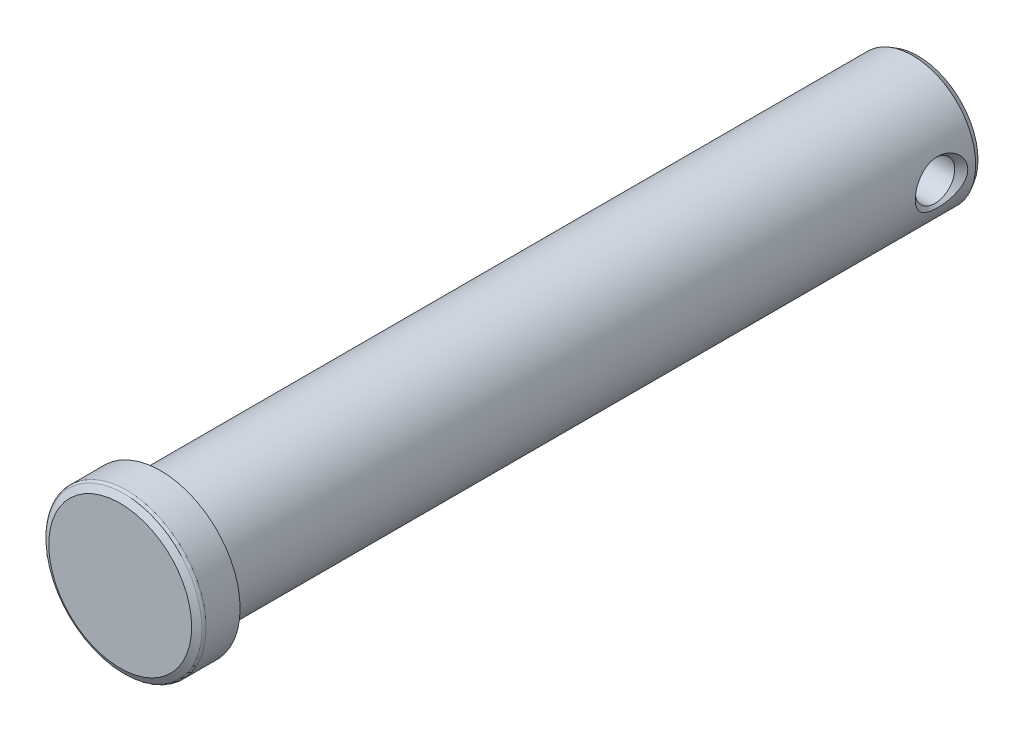
ISO-10303-21;
HEADER;
FILE_DESCRIPTION(('STEP AP214'),'2;1');
FILE_NAME('part.step','',(''),(''),'','','');
FILE_SCHEMA(('AUTOMOTIVE_DESIGN { 1 0 10303 214 1 1 1 1 }'));
ENDSEC;
DATA;
#1=APPLICATION_CONTEXT('core data for automotive mechanical design processes');
#2=APPLICATION_PROTOCOL_DEFINITION('international standard','automotive_design',2000,#1);
#3=PRODUCT_CONTEXT('',#1,'mechanical');
#4=PRODUCT('Part','Part','',(#3));
#5=PRODUCT_RELATED_PRODUCT_CATEGORY('part','',(#4));
#6=PRODUCT_DEFINITION_FORMATION('','',#4);
#7=PRODUCT_DEFINITION_CONTEXT('part definition',#1,'design');
#8=PRODUCT_DEFINITION('design','',#6,#7);
#9=PRODUCT_DEFINITION_SHAPE('','',#8);
#10=(LENGTH_UNIT() NAMED_UNIT(*) SI_UNIT(.MILLI.,.METRE.));
#11=(NAMED_UNIT(*) PLANE_ANGLE_UNIT() SI_UNIT($,.RADIAN.));
#12=(NAMED_UNIT(*) SI_UNIT($,.STERADIAN.) SOLID_ANGLE_UNIT());
#13=UNCERTAINTY_MEASURE_WITH_UNIT(LENGTH_MEASURE(1.E-05),#10,'distance_accuracy_value','');
#14=(GEOMETRIC_REPRESENTATION_CONTEXT(3) GLOBAL_UNCERTAINTY_ASSIGNED_CONTEXT((#13)) GLOBAL_UNIT_ASSIGNED_CONTEXT((#10,
#11,#12)) REPRESENTATION_CONTEXT('',''));
#15=CARTESIAN_POINT('',(0.,0.,0.));
#16=DIRECTION('',(0.,0.,1.));
#17=DIRECTION('',(1.,0.,0.));
#18=AXIS2_PLACEMENT_3D('',#15,#16,#17);
#19=CARTESIAN_POINT('',(0.,0.,38.1));
#20=DIRECTION('',(0.,0.,1.));
#21=DIRECTION('',(1.,0.,0.));
#22=AXIS2_PLACEMENT_3D('',#19,#20,#21);
#23=CYLINDRICAL_SURFACE('',#22,6.35);
#24=CARTESIAN_POINT('',(-6.08946556806022,-1.8002525087912,-35.6705851077295));
#25=CARTESIAN_POINT('',(-6.06500480892005,-1.88300294252601,-35.5376040751017));
#26=CARTESIAN_POINT('',(-6.04208780252657,-1.95438056437325,-35.3970543772474));
#27=CARTESIAN_POINT('',(-6.0022071070109,-2.0736413122893,-35.1052282418399));
#28=CARTESIAN_POINT('',(-5.98525978427759,-2.12145999025203,-34.953923661142));
#29=CARTESIAN_POINT('',(-5.9594412012259,-2.19294825097273,-34.6444373783609));
#30=CARTESIAN_POINT('',(-5.95059939854113,-2.21652978676401,-34.4862327637109));
#31=CARTESIAN_POINT('',(-5.94224537322893,-2.23883139366819,-34.1679736608714));
#32=CARTESIAN_POINT('',(-5.94272563163844,-2.23757150130075,-34.0079207676002));
#33=CARTESIAN_POINT('',(-5.95301173558375,-2.21006073247549,-33.6878458447917));
#34=CARTESIAN_POINT('',(-5.96295774711407,-2.18343422890581,-33.5278604929284));
#35=CARTESIAN_POINT('',(-5.99108067784824,-2.10503465023391,-33.2147948478071));
#36=CARTESIAN_POINT('',(-6.00926382107226,-2.05324255772764,-33.0617198724207));
#37=CARTESIAN_POINT('',(-6.05152450366875,-1.92512205377195,-32.7670084903579));
#38=CARTESIAN_POINT('',(-6.07560360888412,-1.8487871225745,-32.6253751356451));
#39=CARTESIAN_POINT('',(-6.12653277477935,-1.67227347683413,-32.3584112427695));
#40=CARTESIAN_POINT('',(-6.1533796110556,-1.57212233424682,-32.2330621099863));
#41=CARTESIAN_POINT('',(-6.19998908606651,-1.37490911935274,-32.0307777616048));
#42=CARTESIAN_POINT('',(-6.21995373421023,-1.28249277250774,-31.949351027876));
#43=CARTESIAN_POINT('',(-6.25739264510909,-1.08517007903807,-31.8025438227951));
#44=CARTESIAN_POINT('',(-6.27486839322964,-0.980271251107545,-31.7371537638532));
#45=CARTESIAN_POINT('',(-6.30548318326387,-0.758910929136475,-31.6254038692048));
#46=CARTESIAN_POINT('',(-6.31858355851897,-0.642357589379461,-31.5792128707546));
#47=CARTESIAN_POINT('',(-6.33840122682048,-0.402025659880048,-31.5101311092041));
#48=CARTESIAN_POINT('',(-6.3451261630284,-0.278255911024465,-31.4872124438393));
#49=CARTESIAN_POINT('',(-6.35072723579668,-0.0467433764206158,-31.4681168317929));
#50=CARTESIAN_POINT('',(-6.35060520852393,0.0607035962417174,-31.4685266489524));
#51=CARTESIAN_POINT('',(-6.34498911884112,0.273788077103967,-31.4876872425124));
#52=CARTESIAN_POINT('',(-6.33949588556502,0.379425862020839,-31.5064351881214));
#53=CARTESIAN_POINT('',(-6.32417756565913,0.580469698916779,-31.5596405265989));
#54=CARTESIAN_POINT('',(-6.31458758844323,0.676122816790439,-31.5932483452856));
#55=CARTESIAN_POINT('',(-6.29204970566504,0.860983601418236,-31.6741651708111));
#56=CARTESIAN_POINT('',(-6.2791009947285,0.950189715708347,-31.7214774640965));
#57=CARTESIAN_POINT('',(-6.24946250639317,1.12951599782499,-31.8333344004952));
#58=CARTESIAN_POINT('',(-6.23252592691544,1.21880237139196,-31.8991440353826));
#59=CARTESIAN_POINT('',(-6.19728918701554,1.38690218777346,-32.0426604547941));
#60=CARTESIAN_POINT('',(-6.17898824777129,1.4657095762787,-32.120374061611));
#61=CARTESIAN_POINT('',(-6.13913686365532,1.62524078846704,-32.3001620747707));
#62=CARTESIAN_POINT('',(-6.11758305487082,1.7038473644036,-32.4041151526272));
#63=CARTESIAN_POINT('',(-6.0764153999034,1.84529361558585,-32.622594523765));
#64=CARTESIAN_POINT('',(-6.05680280863153,1.90812313147493,-32.7371275652363));
#65=CARTESIAN_POINT('',(-6.01845917586724,2.0261028027157,-32.9925726985285));
#66=CARTESIAN_POINT('',(-6.00033329120438,2.078563618698,-33.1348253816691));
#67=CARTESIAN_POINT('',(-5.97099633519703,2.1613971099314,-33.4263028000725));
#68=CARTESIAN_POINT('',(-5.95978695701826,2.19176437699161,-33.5755292329041));
#69=CARTESIAN_POINT('',(-5.94516202384055,2.23115255724621,-33.8863956561425));
#70=CARTESIAN_POINT('',(-5.94225933620213,2.23877001127639,-34.0482402682001));
#71=CARTESIAN_POINT('',(-5.94610101898477,2.22854328247117,-34.3710031219965));
#72=CARTESIAN_POINT('',(-5.95284586651847,2.21069784038477,-34.5319213175247));
#73=CARTESIAN_POINT('',(-5.97511909577176,2.14976679229751,-34.8487475863668));
#74=CARTESIAN_POINT('',(-5.99067195482379,2.10661083680852,-35.004640412775));
#75=CARTESIAN_POINT('',(-6.02857982288002,1.99553332203208,-35.3066174397112));
#76=CARTESIAN_POINT('',(-6.05093966695412,1.92759415215532,-35.4526945777297));
#77=CARTESIAN_POINT('',(-6.09945399599868,1.76807007244952,-35.7295721195209));
#78=CARTESIAN_POINT('',(-6.12558665370247,1.67661896153771,-35.8604530739152));
#79=CARTESIAN_POINT('',(-6.1782403973682,1.47073550363506,-36.1025554266451));
#80=CARTESIAN_POINT('',(-6.20476068510954,1.35634551284692,-36.2138123589557));
#81=CARTESIAN_POINT('',(-6.24722726538169,1.14150892720777,-36.3827459673761));
#82=CARTESIAN_POINT('',(-6.26405280688227,1.04615300442206,-36.4466979073511));
#83=CARTESIAN_POINT('',(-6.29422437498016,0.845849711646498,-36.5584042775127));
#84=CARTESIAN_POINT('',(-6.30757331110262,0.740910461813067,-36.6061722619782));
#85=CARTESIAN_POINT('',(-6.32937545727361,0.52302231496942,-36.6830503040396));
#86=CARTESIAN_POINT('',(-6.33779464021358,0.410023650646075,-36.7120308267339));
#87=CARTESIAN_POINT('',(-6.34847673905213,0.180330946879257,-36.7486665383719));
#88=CARTESIAN_POINT('',(-6.35074333034458,0.063639155782347,-36.7563344589601));
#89=CARTESIAN_POINT('',(-6.34892866518301,-0.155812740536091,-36.7501493854636));
#90=CARTESIAN_POINT('',(-6.34553766901893,-0.258653034809978,-36.7386367708582));
#91=CARTESIAN_POINT('',(-6.33406633574385,-0.460820581321476,-36.6991559544886));
#92=CARTESIAN_POINT('',(-6.32598614225238,-0.560147941053502,-36.6711882567061));
#93=CARTESIAN_POINT('',(-6.30594374300713,-0.75299616537357,-36.600313121469));
#94=CARTESIAN_POINT('',(-6.29397610210368,-0.846508680692122,-36.5573847609307));
#95=CARTESIAN_POINT('',(-6.2672271323794,-1.02596917611207,-36.4585401872414));
#96=CARTESIAN_POINT('',(-6.25244376570881,-1.11191161116184,-36.4026145609714));
#97=CARTESIAN_POINT('',(-6.21909656985284,-1.28617283380978,-36.2714795187687));
#98=CARTESIAN_POINT('',(-6.20029178438864,-1.37324818408096,-36.194686449477));
#99=CARTESIAN_POINT('',(-6.16214963339903,-1.53536698073819,-36.0296294095048));
#100=CARTESIAN_POINT('',(-6.14281281527593,-1.61042228910788,-35.9413769053114));
#101=CARTESIAN_POINT('',(-6.11221857254795,-1.72198668265558,-35.7909271009807));
#102=CARTESIAN_POINT('',(-6.10067983343983,-1.76231479316832,-35.7315515144463));
#103=CARTESIAN_POINT('',(-6.08946556806022,-1.8002525087912,-35.6705851077295));
#104=B_SPLINE_CURVE_WITH_KNOTS('',3,(#24,#25,#26,#27,#28,#29,#30,#31,#32,#33,#34,#35,#36,#37,
#38,#39,#40,#41,#42,#43,#44,#45,#46,#47,#48,#49,#50,#51,#52,#53,#54,#55,#56,#57,#58,#59,#60,#61,
#62,#63,#64,#65,#66,#67,#68,#69,#70,#71,#72,#73,#74,#75,#76,#77,#78,#79,#80,#81,#82,#83,#84,#85,
#86,#87,#88,#89,#90,#91,#92,#93,#94,#95,#96,#97,#98,#99,#100,#101,#102,#103),.UNSPECIFIED.,.T.,
.F.,(4,2,2,2,2,2,2,2,2,2,2,2,2,2,2,2,2,2,2,2,2,2,2,2,2,2,2,2,2,2,2,2,2,2,2,2,2,2,2,4),(0.,
0.475345116727028,0.951983470667516,1.43034726725992,1.90832524250667,2.3934929202136,
2.87902780623024,3.36469178017719,3.8497962163968,4.2226716286508,4.59532356942102,
4.97118662303262,5.34659850325448,5.66724743669547,5.98784688051472,6.292102503239,
6.59643114947533,6.93178242409056,7.26732661618259,7.66210046034174,8.05712786393975,
8.513232506931,8.96944876041124,9.45328164912772,9.93713846631535,10.4223465593295,
10.9079001078781,11.3907494347638,11.8727152658357,12.2194746987905,12.5659429940092,
12.9147753878844,13.2633993527014,13.572515550398,13.8816222810624,14.1911630562253,
14.5009287152005,14.8524821484737,15.2036864843368,15.4216129295191),.UNSPECIFIED.);
#105=CARTESIAN_POINT('',(-6.08946556806022,-1.8002525087912,-35.6705851077295));
#106=VERTEX_POINT('',#105);
#107=EDGE_CURVE('E54',#106,#106,#104,.T.);
#108=ORIENTED_EDGE('',*,*,#107,.F.);
#109=EDGE_LOOP('',(#108));
#110=FACE_BOUND('',#109,.T.);
#111=CARTESIAN_POINT('',(0.,0.,37.7825));
#112=DIRECTION('',(0.,0.,1.));
#113=DIRECTION('',(1.,0.,0.));
#114=AXIS2_PLACEMENT_3D('',#111,#112,#113);
#115=CIRCLE('',#114,6.35);
#116=CARTESIAN_POINT('',(6.35,0.,37.7825));
#117=VERTEX_POINT('',#116);
#118=EDGE_CURVE('E10',#117,#117,#115,.F.);
#119=ORIENTED_EDGE('',*,*,#118,.T.);
#120=EDGE_LOOP('',(#119));
#121=FACE_BOUND('',#120,.T.);
#122=CARTESIAN_POINT('',(0.,0.,-37.5500738685969));
#123=DIRECTION('',(0.,0.,1.));
#124=DIRECTION('',(1.,0.,0.));
#125=AXIS2_PLACEMENT_3D('',#122,#123,#124);
#126=CIRCLE('',#125,6.35);
#127=CARTESIAN_POINT('',(6.35,0.,-37.5500738685969));
#128=VERTEX_POINT('',#127);
#129=EDGE_CURVE('E120',#128,#128,#126,.T.);
#130=ORIENTED_EDGE('',*,*,#129,.T.);
#131=EDGE_LOOP('',(#130));
#132=FACE_BOUND('',#131,.T.);
#133=CARTESIAN_POINT('',(6.08946556806022,-1.80025250879121,-35.6705851077295));
#134=CARTESIAN_POINT('',(6.11189885307447,-1.72437582976485,-35.7925115513243));
#135=CARTESIAN_POINT('',(6.13567120927757,-1.63879505075025,-35.9083158181569));
#136=CARTESIAN_POINT('',(6.18326701862847,-1.4488838411212,-36.1236028311477));
#137=CARTESIAN_POINT('',(6.20709048724993,-1.34454658363101,-36.2230796092159));
#138=CARTESIAN_POINT('',(6.24721455696843,-1.14158319658968,-36.3826960498219));
#139=CARTESIAN_POINT('',(6.26405885665663,-1.04612617970624,-36.4467209222515));
#140=CARTESIAN_POINT('',(6.29425628313995,-0.845624573699038,-36.5585217925724));
#141=CARTESIAN_POINT('',(6.30761283559113,-0.740589529976808,-36.6063137483764));
#142=CARTESIAN_POINT('',(6.32942136453854,-0.52248879681383,-36.6832100165142));
#143=CARTESIAN_POINT('',(6.33783881091457,-0.409372628572175,-36.712182908602));
#144=CARTESIAN_POINT('',(6.34850391117207,-0.179446866223698,-36.7487590926882));
#145=CARTESIAN_POINT('',(6.35075521626093,-0.0626394992872966,-36.756375031017));
#146=CARTESIAN_POINT('',(6.34890153743061,0.156905979489945,-36.7500569355074));
#147=CARTESIAN_POINT('',(6.34549344786971,0.259726648315926,-36.7384858281983));
#148=CARTESIAN_POINT('',(6.33399080315791,0.461854344791243,-36.6988947392515));
#149=CARTESIAN_POINT('',(6.32589601519649,0.56116119763264,-36.6708739404787));
#150=CARTESIAN_POINT('',(6.30582430674266,0.75399727275381,-36.5998863541959));
#151=CARTESIAN_POINT('',(6.29384055195132,0.847515976142199,-36.55689324521));
#152=CARTESIAN_POINT('',(6.26706716802248,1.02694321544018,-36.4579396142315));
#153=CARTESIAN_POINT('',(6.25227656719524,1.11284910074856,-36.401974600062));
#154=CARTESIAN_POINT('',(6.21892575998042,1.28699227823206,-36.2707877531108));
#155=CARTESIAN_POINT('',(6.20012607810153,1.37399201618974,-36.1939888934815));
#156=CARTESIAN_POINT('',(6.16197335204065,1.53607631546078,-36.0288468983292));
#157=CARTESIAN_POINT('',(6.14261996400546,1.61115327445182,-35.9404964621068));
#158=CARTESIAN_POINT('',(6.10140351613906,1.76139158640437,-35.7376620687535));
#159=CARTESIAN_POINT('',(6.07971776048924,1.83412358453758,-35.6213391839536));
#160=CARTESIAN_POINT('',(6.03969744478187,1.96189737041277,-35.3788156141223));
#161=CARTESIAN_POINT('',(6.02136479154187,2.01692910590803,-35.252609366589));
#162=CARTESIAN_POINT('',(5.98773555422385,2.11484477852755,-34.9762790094029));
#163=CARTESIAN_POINT('',(5.97314111857424,2.15522747635952,-34.8251757795304));
#164=CARTESIAN_POINT('',(5.95222989788353,2.21232631826541,-34.5180121640277));
#165=CARTESIAN_POINT('',(5.94591410081834,2.22903963764574,-34.3619511890141));
#166=CARTESIAN_POINT('',(5.94228838161847,2.23869386932952,-34.0436255391491));
#167=CARTESIAN_POINT('',(5.94529359255187,2.23080289010089,-33.8813311122064));
#168=CARTESIAN_POINT('',(5.96060707529366,2.18955108708922,-33.5604479532095));
#169=CARTESIAN_POINT('',(5.97291664199062,2.15618671816425,-33.401859740117));
#170=CARTESIAN_POINT('',(6.00523220188742,2.06447084476844,-33.0928139708271));
#171=CARTESIAN_POINT('',(6.0252418465513,2.00610748400591,-32.9423603107909));
#172=CARTESIAN_POINT('',(6.0704127050017,1.86495709107726,-32.6540102016395));
#173=CARTESIAN_POINT('',(6.09557758354086,1.78215266568471,-32.5161227869291));
#174=CARTESIAN_POINT('',(6.14721222459255,1.59484330121307,-32.2606569157582));
#175=CARTESIAN_POINT('',(6.17364381078571,1.4908271326132,-32.1427147763513));
#176=CARTESIAN_POINT('',(6.22456851695178,1.26132323708167,-31.929560750757));
#177=CARTESIAN_POINT('',(6.24906636381853,1.13589039856351,-31.8342922130148));
#178=CARTESIAN_POINT('',(6.28540113685932,0.908346095763533,-31.6982080394794));
#179=CARTESIAN_POINT('',(6.29880790373836,0.811076327864129,-31.649668778725));
#180=CARTESIAN_POINT('',(6.32148927889785,0.609521816653048,-31.5689062250587));
#181=CARTESIAN_POINT('',(6.33076759780302,0.505243470055969,-31.5366682770526));
#182=CARTESIAN_POINT('',(6.34419395123225,0.291844893096903,-31.4903368699096));
#183=CARTESIAN_POINT('',(6.34831761520562,0.182704169984703,-31.4763295903039));
#184=CARTESIAN_POINT('',(6.35083977755019,-0.0364115933576421,-31.4677391597493));
#185=CARTESIAN_POINT('',(6.34923907328846,-0.146386515259938,-31.4731533035234));
#186=CARTESIAN_POINT('',(6.34085413255749,-0.355208505466416,-31.501857193427));
#187=CARTESIAN_POINT('',(6.33447160838138,-0.45426759333662,-31.523762227413));
#188=CARTESIAN_POINT('',(6.31765206007372,-0.647443204653349,-31.5825475786945));
#189=CARTESIAN_POINT('',(6.30721434093977,-0.741558877728848,-31.6194304630285));
#190=CARTESIAN_POINT('',(6.28261327724273,-0.927651644214925,-31.7086466651868));
#191=CARTESIAN_POINT('',(6.26828610687198,-1.01927058904418,-31.7616762733222));
#192=CARTESIAN_POINT('',(6.23743144988352,-1.19365245639292,-31.880142193726));
#193=CARTESIAN_POINT('',(6.22090297266944,-1.27641136143826,-31.9455840972305));
#194=CARTESIAN_POINT('',(6.18416451606159,-1.4447030026332,-32.0980719283945));
#195=CARTESIAN_POINT('',(6.16378710917425,-1.52858343017283,-32.1868984967215));
#196=CARTESIAN_POINT('',(6.12348829020788,-1.6827812757831,-32.3757167789207));
#197=CARTESIAN_POINT('',(6.10356719773982,-1.7530894290545,-32.4757160465753));
#198=CARTESIAN_POINT('',(6.06245060141608,-1.8908300496121,-32.7028082667539));
#199=CARTESIAN_POINT('',(6.04164029290323,-1.95561508845976,-32.8315827180628));
#200=CARTESIAN_POINT('',(6.00498393293476,-2.0654351180514,-33.0979474364711));
#201=CARTESIAN_POINT('',(5.98913957784354,-2.11046336199131,-33.2355406967757));
#202=CARTESIAN_POINT('',(5.96283306522677,-2.18376170807069,-33.5302238771174));
#203=CARTESIAN_POINT('',(5.95305462062976,-2.20994473845573,-33.6878993965439));
#204=CARTESIAN_POINT('',(5.94275054135037,-2.23750616897616,-34.0057768775783));
#205=CARTESIAN_POINT('',(5.94222987606924,-2.238871247312,-34.1659801498629));
#206=CARTESIAN_POINT('',(5.95057899844324,-2.21658575266837,-34.4868645223076));
#207=CARTESIAN_POINT('',(5.95959388675535,-2.19254864473195,-34.6475148144247));
#208=CARTESIAN_POINT('',(5.98604352484256,-2.1192661549129,-34.9620283430453));
#209=CARTESIAN_POINT('',(6.00346320460979,-2.0700658817951,-35.1159031912729));
#210=CARTESIAN_POINT('',(6.03367699203313,-1.97943564895926,-35.3347009002995));
#211=CARTESIAN_POINT('',(6.04411315731117,-1.94743913444231,-35.4039910723779));
#212=CARTESIAN_POINT('',(6.06606240733106,-1.87795598407714,-35.5396232214436));
#213=CARTESIAN_POINT('',(6.07757591475985,-1.84046719008438,-35.6059640260836));
#214=CARTESIAN_POINT('',(6.08946556806022,-1.80025250879121,-35.6705851077295));
#215=B_SPLINE_CURVE_WITH_KNOTS('',3,(#133,#134,#135,#136,#137,#138,#139,#140,#141,#142,#143,
#144,#145,#146,#147,#148,#149,#150,#151,#152,#153,#154,#155,#156,#157,#158,#159,#160,#161,#162,
#163,#164,#165,#166,#167,#168,#169,#170,#171,#172,#173,#174,#175,#176,#177,#178,#179,#180,#181,
#182,#183,#184,#185,#186,#187,#188,#189,#190,#191,#192,#193,#194,#195,#196,#197,#198,#199,#200,
#201,#202,#203,#204,#205,#206,#207,#208,#209,#210,#211,#212,#213,#214),.UNSPECIFIED.,.T.,.F.,(4,
2,2,2,2,2,2,2,2,2,2,2,2,2,2,2,2,2,2,2,2,2,2,2,2,2,2,2,2,2,2,2,2,2,2,2,2,2,2,2,4),(0.,
0.435784881783131,0.871728700388985,1.21883366992793,1.56559642051268,1.91475542096825,
2.26370762632091,2.57278757624339,2.88188288094847,3.19152434462416,3.50127319791483,
3.85263955839028,4.20422906878143,4.61926176838314,5.03452975684516,5.5036567623974,
5.97283974865122,6.4580561128942,6.94334001720641,7.42885433278455,7.91471499597782,
8.39043932559316,8.86496224450962,9.19223303237606,9.5192090740652,9.84772524059639,
10.1761956487556,10.4797920034177,10.7834404131219,11.1026854432247,11.4220746232922,
11.7922618726109,12.1627009349645,12.5978453728829,13.0331382940766,13.5112994067704,
13.9897171795833,14.4755211094538,14.9604571992523,15.1913324594131,15.422298684585),.UNSPECIFIED.);
#216=CARTESIAN_POINT('',(6.08946556806022,-1.80025250879121,-35.6705851077295));
#217=VERTEX_POINT('',#216);
#218=EDGE_CURVE('E62',#217,#217,#215,.T.);
#219=ORIENTED_EDGE('',*,*,#218,.F.);
#220=EDGE_LOOP('',(#219));
#221=FACE_BOUND('',#220,.T.);
#222=ADVANCED_FACE('F36',(#110,#121,#132,#221),#23,.T.);
#223=CARTESIAN_POINT('',(0.,0.,-38.1));
#224=DIRECTION('',(0.,0.,1.));
#225=DIRECTION('',(1.,0.,0.));
#226=AXIS2_PLACEMENT_3D('',#223,#224,#225);
#227=CONICAL_SURFACE('',#226,6.0325,0.523598775598289);
#228=ORIENTED_EDGE('',*,*,#129,.F.);
#229=EDGE_LOOP('',(#228));
#230=FACE_BOUND('',#229,.T.);
#231=CARTESIAN_POINT('',(0.,0.,-38.1));
#232=DIRECTION('',(0.,0.,1.));
#233=DIRECTION('',(1.,0.,0.));
#234=AXIS2_PLACEMENT_3D('',#231,#232,#233);
#235=CIRCLE('',#234,6.0325);
#236=CARTESIAN_POINT('',(6.0325,0.,-38.1));
#237=VERTEX_POINT('',#236);
#238=EDGE_CURVE('E124',#237,#237,#235,.T.);
#239=ORIENTED_EDGE('',*,*,#238,.T.);
#240=EDGE_LOOP('',(#239));
#241=FACE_BOUND('',#240,.T.);
#242=ADVANCED_FACE('F105',(#230,#241),#227,.T.);
#243=CARTESIAN_POINT('',(0.,8.001,38.1));
#244=DIRECTION('',(0.,0.,1.));
#245=DIRECTION('',(1.,0.,0.));
#246=AXIS2_PLACEMENT_3D('',#243,#244,#245);
#247=PLANE('',#246);
#248=CARTESIAN_POINT('',(0.,0.,38.1));
#249=DIRECTION('',(0.,0.,1.));
#250=DIRECTION('',(1.,0.,0.));
#251=AXIS2_PLACEMENT_3D('',#248,#249,#250);
#252=CIRCLE('',#251,6.6675);
#253=CARTESIAN_POINT('',(6.6675,0.,38.1));
#254=VERTEX_POINT('',#253);
#255=EDGE_CURVE('E44',#254,#254,#252,.T.);
#256=ORIENTED_EDGE('',*,*,#255,.T.);
#257=EDGE_LOOP('',(#256));
#258=FACE_BOUND('',#257,.T.);
#259=CARTESIAN_POINT('',(0.,0.,38.1));
#260=DIRECTION('',(0.,0.,1.));
#261=DIRECTION('',(1.,0.,0.));
#262=AXIS2_PLACEMENT_3D('',#259,#260,#261);
#263=CIRCLE('',#262,8.001);
#264=CARTESIAN_POINT('',(8.001,0.,38.1));
#265=VERTEX_POINT('',#264);
#266=EDGE_CURVE('E130',#265,#265,#263,.T.);
#267=ORIENTED_EDGE('',*,*,#266,.F.);
#268=EDGE_LOOP('',(#267));
#269=FACE_BOUND('',#268,.T.);
#270=ADVANCED_FACE('F102',(#258,#269),#247,.F.);
#271=CARTESIAN_POINT('',(0.,0.,38.1));
#272=DIRECTION('',(0.,0.,1.));
#273=DIRECTION('',(1.,0.,0.));
#274=AXIS2_PLACEMENT_3D('',#271,#272,#273);
#275=CYLINDRICAL_SURFACE('',#274,8.001);
#276=CARTESIAN_POINT('',(0.,0.,41.511420990735));
#277=DIRECTION('',(0.,0.,-1.));
#278=DIRECTION('',(-1.,0.,0.));
#279=AXIS2_PLACEMENT_3D('',#276,#277,#278);
#280=CIRCLE('',#279,8.001);
#281=CARTESIAN_POINT('',(-8.001,0.,41.511420990735));
#282=VERTEX_POINT('',#281);
#283=EDGE_CURVE('E49',#282,#282,#280,.T.);
#284=ORIENTED_EDGE('',*,*,#283,.T.);
#285=EDGE_LOOP('',(#284));
#286=FACE_BOUND('',#285,.T.);
#287=ORIENTED_EDGE('',*,*,#266,.T.);
#288=EDGE_LOOP('',(#287));
#289=FACE_BOUND('',#288,.T.);
#290=ADVANCED_FACE('F99',(#286,#289),#275,.T.);
#291=CARTESIAN_POINT('',(0.,0.,41.6947297012027));
#292=DIRECTION('',(0.,0.,-1.));
#293=DIRECTION('',(-1.,0.,0.));
#294=AXIS2_PLACEMENT_3D('',#291,#292,#293);
#295=CONICAL_SURFACE('',#294,8.001,1.04719755119659);
#296=CARTESIAN_POINT('',(0.,0.,41.7863840564365));
#297=DIRECTION('',(0.,0.,1.));
#298=DIRECTION('',(1.,0.,0.));
#299=AXIS2_PLACEMENT_3D('',#296,#297,#298);
#300=CIRCLE('',#299,7.84225);
#301=CARTESIAN_POINT('',(7.84225,0.,41.7863840564365));
#302=VERTEX_POINT('',#301);
#303=EDGE_CURVE('E136',#302,#302,#300,.T.);
#304=ORIENTED_EDGE('',*,*,#303,.T.);
#305=EDGE_LOOP('',(#304));
#306=FACE_BOUND('',#305,.T.);
#307=CARTESIAN_POINT('',(0.,0.,42.164));
#308=DIRECTION('',(0.,0.,1.));
#309=DIRECTION('',(1.,0.,0.));
#310=AXIS2_PLACEMENT_3D('',#307,#308,#309);
#311=CIRCLE('',#310,7.1882);
#312=CARTESIAN_POINT('',(7.1882,0.,42.164));
#313=VERTEX_POINT('',#312);
#314=EDGE_CURVE('E126',#313,#313,#311,.T.);
#315=ORIENTED_EDGE('',*,*,#314,.F.);
#316=EDGE_LOOP('',(#315));
#317=FACE_BOUND('',#316,.T.);
#318=ADVANCED_FACE('F95',(#306,#317),#295,.T.);
#319=CARTESIAN_POINT('',(0.,0.,42.164));
#320=DIRECTION('',(0.,0.,-1.));
#321=DIRECTION('',(-1.,0.,0.));
#322=AXIS2_PLACEMENT_3D('',#319,#320,#321);
#323=PLANE('',#322);
#324=ORIENTED_EDGE('',*,*,#314,.T.);
#325=EDGE_LOOP('',(#324));
#326=FACE_BOUND('',#325,.T.);
#327=ADVANCED_FACE('F91',(#326),#323,.F.);
#328=CARTESIAN_POINT('',(0.,6.0325,-38.1));
#329=DIRECTION('',(0.,0.,1.));
#330=DIRECTION('',(1.,0.,0.));
#331=AXIS2_PLACEMENT_3D('',#328,#329,#330);
#332=PLANE('',#331);
#333=ORIENTED_EDGE('',*,*,#238,.F.);
#334=EDGE_LOOP('',(#333));
#335=FACE_BOUND('',#334,.T.);
#336=ADVANCED_FACE('F87',(#335),#332,.F.);
#337=CARTESIAN_POINT('',(0.,0.,41.511420990735));
#338=DIRECTION('',(0.,0.,-1.));
#339=DIRECTION('',(-1.,0.,0.));
#340=AXIS2_PLACEMENT_3D('',#337,#338,#339);
#341=TOROIDAL_SURFACE('',#340,7.6835,0.3175);
#342=ORIENTED_EDGE('',*,*,#283,.F.);
#343=EDGE_LOOP('',(#342));
#344=FACE_BOUND('',#343,.T.);
#345=ORIENTED_EDGE('',*,*,#303,.F.);
#346=EDGE_LOOP('',(#345));
#347=FACE_BOUND('',#346,.T.);
#348=ADVANCED_FACE('F90',(#344,#347),#341,.T.);
#349=CARTESIAN_POINT('',(0.,0.,37.7825));
#350=DIRECTION('',(0.,0.,1.));
#351=DIRECTION('',(1.,0.,0.));
#352=AXIS2_PLACEMENT_3D('',#349,#350,#351);
#353=TOROIDAL_SURFACE('',#352,6.6675,0.3175);
#354=ORIENTED_EDGE('',*,*,#118,.F.);
#355=EDGE_LOOP('',(#354));
#356=FACE_BOUND('',#355,.T.);
#357=ORIENTED_EDGE('',*,*,#255,.F.);
#358=EDGE_LOOP('',(#357));
#359=FACE_BOUND('',#358,.T.);
#360=ADVANCED_FACE('F38',(#356,#359),#353,.F.);
#361=CARTESIAN_POINT('',(-6.35,0.,-34.1122));
#362=DIRECTION('',(-1.,0.,0.));
#363=DIRECTION('',(0.,0.,1.));
#364=AXIS2_PLACEMENT_3D('',#361,#362,#363);
#365=CONICAL_SURFACE('',#364,2.6416,0.78539816339745);
#366=CARTESIAN_POINT('',(-5.6896,0.,-34.1122));
#367=DIRECTION('',(-1.,0.,0.));
#368=DIRECTION('',(0.,0.,1.));
#369=AXIS2_PLACEMENT_3D('',#366,#367,#368);
#370=CIRCLE('',#369,1.98119999999999);
#371=CARTESIAN_POINT('',(-5.6896,0.,-32.131));
#372=VERTEX_POINT('',#371);
#373=EDGE_CURVE('E52',#372,#372,#370,.F.);
#374=ORIENTED_EDGE('',*,*,#373,.T.);
#375=EDGE_LOOP('',(#374));
#376=FACE_BOUND('',#375,.T.);
#377=ORIENTED_EDGE('',*,*,#107,.T.);
#378=EDGE_LOOP('',(#377));
#379=FACE_BOUND('',#378,.T.);
#380=ADVANCED_FACE('F77',(#376,#379),#365,.F.);
#381=CARTESIAN_POINT('',(3.70840000000002,0.,-34.1122));
#382=DIRECTION('',(1.,0.,0.));
#383=DIRECTION('',(0.,0.,-1.));
#384=AXIS2_PLACEMENT_3D('',#381,#382,#383);
#385=CONICAL_SURFACE('',#384,0.,0.78539816339745);
#386=CARTESIAN_POINT('',(5.68959999999999,0.,-34.1122));
#387=DIRECTION('',(1.,0.,0.));
#388=DIRECTION('',(0.,0.,-1.));
#389=AXIS2_PLACEMENT_3D('',#386,#387,#388);
#390=CIRCLE('',#389,1.98119999999999);
#391=CARTESIAN_POINT('',(5.68959999999999,0.,-36.0934));
#392=VERTEX_POINT('',#391);
#393=EDGE_CURVE('E40',#392,#392,#390,.F.);
#394=ORIENTED_EDGE('',*,*,#393,.T.);
#395=EDGE_LOOP('',(#394));
#396=FACE_BOUND('',#395,.T.);
#397=ORIENTED_EDGE('',*,*,#218,.T.);
#398=EDGE_LOOP('',(#397));
#399=FACE_BOUND('',#398,.T.);
#400=ADVANCED_FACE('F81',(#396,#399),#385,.F.);
#401=CARTESIAN_POINT('',(-8.001,0.,-34.1122));
#402=DIRECTION('',(1.,0.,0.));
#403=DIRECTION('',(0.,0.,-1.));
#404=AXIS2_PLACEMENT_3D('',#401,#402,#403);
#405=CYLINDRICAL_SURFACE('',#404,1.98119999999999);
#406=ORIENTED_EDGE('',*,*,#373,.F.);
#407=EDGE_LOOP('',(#406));
#408=FACE_BOUND('',#407,.T.);
#409=ORIENTED_EDGE('',*,*,#393,.F.);
#410=EDGE_LOOP('',(#409));
#411=FACE_BOUND('',#410,.T.);
#412=ADVANCED_FACE('F83',(#408,#411),#405,.F.);
#413=CLOSED_SHELL('',(#222,#242,#270,#290,#318,#327,#336,#348,#360,#380,#400,#412));
#414=MANIFOLD_SOLID_BREP('B2',#413);
#415=ADVANCED_BREP_SHAPE_REPRESENTATION('',(#18,#414),#14);
#416=SHAPE_DEFINITION_REPRESENTATION(#9,#415);
ENDSEC;
END-ISO-10303-21;
